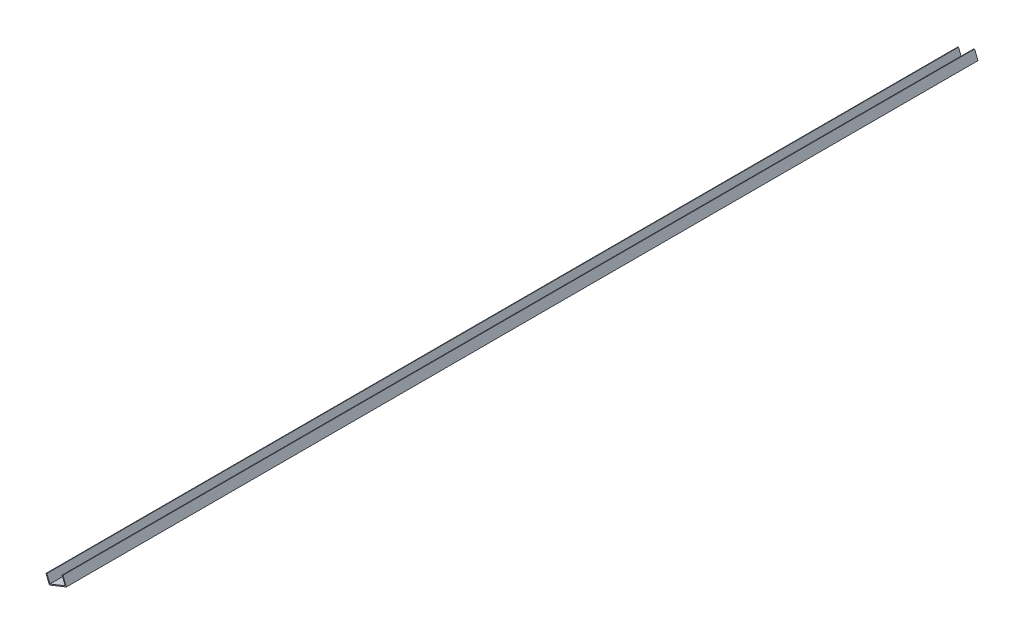
ISO-10303-21;
HEADER;
FILE_DESCRIPTION(('STEP AP214'),'2;1');
FILE_NAME('part.step','',(''),(''),'','','');
FILE_SCHEMA(('AUTOMOTIVE_DESIGN { 1 0 10303 214 1 1 1 1 }'));
ENDSEC;
DATA;
#1=APPLICATION_CONTEXT('core data for automotive mechanical design processes');
#2=APPLICATION_PROTOCOL_DEFINITION('international standard','automotive_design',2000,#1);
#3=PRODUCT_CONTEXT('',#1,'mechanical');
#4=PRODUCT('Part','Part','',(#3));
#5=PRODUCT_RELATED_PRODUCT_CATEGORY('part','',(#4));
#6=PRODUCT_DEFINITION_FORMATION('','',#4);
#7=PRODUCT_DEFINITION_CONTEXT('part definition',#1,'design');
#8=PRODUCT_DEFINITION('design','',#6,#7);
#9=PRODUCT_DEFINITION_SHAPE('','',#8);
#10=(LENGTH_UNIT() NAMED_UNIT(*) SI_UNIT(.MILLI.,.METRE.));
#11=(NAMED_UNIT(*) PLANE_ANGLE_UNIT() SI_UNIT($,.RADIAN.));
#12=(NAMED_UNIT(*) SI_UNIT($,.STERADIAN.) SOLID_ANGLE_UNIT());
#13=UNCERTAINTY_MEASURE_WITH_UNIT(LENGTH_MEASURE(1.E-05),#10,'distance_accuracy_value','');
#14=(GEOMETRIC_REPRESENTATION_CONTEXT(3) GLOBAL_UNCERTAINTY_ASSIGNED_CONTEXT((#13)) GLOBAL_UNIT_ASSIGNED_CONTEXT((#10,
#11,#12)) REPRESENTATION_CONTEXT('',''));
#15=CARTESIAN_POINT('',(0.,0.,0.));
#16=DIRECTION('',(0.,0.,1.));
#17=DIRECTION('',(1.,0.,0.));
#18=AXIS2_PLACEMENT_3D('',#15,#16,#17);
#19=CARTESIAN_POINT('',(9496.46192244909,3814.27996112395,5000.));
#20=DIRECTION('',(-0.927946902696305,-0.372712416987057,0.));
#21=DIRECTION('',(0.372712416987057,-0.927946902696305,0.));
#22=AXIS2_PLACEMENT_3D('',#19,#20,#21);
#23=PLANE('',#22);
#24=DIRECTION('',(-0.372712416987057,0.927946902696305,0.));
#25=VECTOR('',#24,1.);
#26=CARTESIAN_POINT('',(9496.46192244909,3814.27996112395,0.));
#27=LINE('',#26,#25);
#28=CARTESIAN_POINT('',(6775.52101734413,10588.6415606719,0.));
#29=VERTEX_POINT('',#28);
#30=CARTESIAN_POINT('',(6756.88539649478,10635.0389058067,0.));
#31=VERTEX_POINT('',#30);
#32=EDGE_CURVE('E135',#29,#31,#27,.T.);
#33=ORIENTED_EDGE('',*,*,#32,.F.);
#34=DIRECTION('',(0.,0.,-1.));
#35=VECTOR('',#34,1.);
#36=CARTESIAN_POINT('',(6775.52101734413,10588.6415606719,5000.));
#37=LINE('',#36,#35);
#38=CARTESIAN_POINT('',(6775.52101734413,10588.6415606719,5000.));
#39=VERTEX_POINT('',#38);
#40=EDGE_CURVE('E11',#39,#29,#37,.T.);
#41=ORIENTED_EDGE('',*,*,#40,.F.);
#42=DIRECTION('',(-0.372712416987057,0.927946902696305,0.));
#43=VECTOR('',#42,1.);
#44=CARTESIAN_POINT('',(9496.46192244909,3814.27996112395,5000.));
#45=LINE('',#44,#43);
#46=CARTESIAN_POINT('',(6756.88539649478,10635.0389058067,5000.));
#47=VERTEX_POINT('',#46);
#48=EDGE_CURVE('E155',#39,#47,#45,.T.);
#49=ORIENTED_EDGE('',*,*,#48,.T.);
#50=DIRECTION('',(0.,0.,-1.));
#51=VECTOR('',#50,1.);
#52=CARTESIAN_POINT('',(6756.88539649478,10635.0389058067,5000.));
#53=LINE('',#52,#51);
#54=EDGE_CURVE('E57',#47,#31,#53,.T.);
#55=ORIENTED_EDGE('',*,*,#54,.T.);
#56=EDGE_LOOP('',(#33,#41,#49,#55));
#57=FACE_BOUND('',#56,.T.);
#58=ADVANCED_FACE('F41',(#57),#23,.T.);
#59=CARTESIAN_POINT('',(-2720.9409051051,6774.36159954736,5000.));
#60=DIRECTION('',(-0.372712416987103,0.927946902696287,0.));
#61=DIRECTION('',(-0.927946902696287,-0.372712416987103,0.));
#62=AXIS2_PLACEMENT_3D('',#59,#60,#61);
#63=PLANE('',#62);
#64=DIRECTION('',(0.927946902696287,0.372712416987103,0.));
#65=VECTOR('',#64,1.);
#66=CARTESIAN_POINT('',(-2720.9409051051,6774.36159954736,0.));
#67=LINE('',#66,#65);
#68=CARTESIAN_POINT('',(6868.31570761376,10625.9128023706,0.));
#69=VERTEX_POINT('',#68);
#70=EDGE_CURVE('E137',#29,#69,#67,.T.);
#71=ORIENTED_EDGE('',*,*,#70,.T.);
#72=DIRECTION('',(0.,0.,-1.));
#73=VECTOR('',#72,1.);
#74=CARTESIAN_POINT('',(6868.31570761376,10625.9128023706,5000.));
#75=LINE('',#74,#73);
#76=CARTESIAN_POINT('',(6868.31570761376,10625.9128023706,5000.));
#77=VERTEX_POINT('',#76);
#78=EDGE_CURVE('E49',#77,#69,#75,.T.);
#79=ORIENTED_EDGE('',*,*,#78,.F.);
#80=DIRECTION('',(0.927946902696287,0.372712416987103,0.));
#81=VECTOR('',#80,1.);
#82=CARTESIAN_POINT('',(-2720.9409051051,6774.36159954736,5000.));
#83=LINE('',#82,#81);
#84=EDGE_CURVE('E180',#39,#77,#83,.T.);
#85=ORIENTED_EDGE('',*,*,#84,.F.);
#86=ORIENTED_EDGE('',*,*,#40,.T.);
#87=EDGE_LOOP('',(#71,#79,#85,#86));
#88=FACE_BOUND('',#87,.T.);
#89=ADVANCED_FACE('F171',(#88),#63,.F.);
#90=CARTESIAN_POINT('',(9589.25661271878,3851.5512028229,5000.));
#91=DIRECTION('',(0.927946902696298,0.372712416987075,0.));
#92=DIRECTION('',(-0.372712416987075,0.927946902696298,0.));
#93=AXIS2_PLACEMENT_3D('',#90,#91,#92);
#94=PLANE('',#93);
#95=DIRECTION('',(0.372712416987075,-0.927946902696298,0.));
#96=VECTOR('',#95,1.);
#97=CARTESIAN_POINT('',(9589.25661271878,3851.5512028229,0.));
#98=LINE('',#97,#96);
#99=CARTESIAN_POINT('',(6849.68008676441,10672.3101475054,0.));
#100=VERTEX_POINT('',#99);
#101=EDGE_CURVE('E140',#100,#69,#98,.T.);
#102=ORIENTED_EDGE('',*,*,#101,.F.);
#103=DIRECTION('',(0.,0.,-1.));
#104=VECTOR('',#103,1.);
#105=CARTESIAN_POINT('',(6849.68008676441,10672.3101475054,5000.));
#106=LINE('',#105,#104);
#107=CARTESIAN_POINT('',(6849.68008676441,10672.3101475054,5000.));
#108=VERTEX_POINT('',#107);
#109=EDGE_CURVE('E161',#108,#100,#106,.T.);
#110=ORIENTED_EDGE('',*,*,#109,.F.);
#111=DIRECTION('',(0.372712416987075,-0.927946902696298,0.));
#112=VECTOR('',#111,1.);
#113=CARTESIAN_POINT('',(9589.25661271878,3851.5512028229,5000.));
#114=LINE('',#113,#112);
#115=EDGE_CURVE('E168',#108,#77,#114,.T.);
#116=ORIENTED_EDGE('',*,*,#115,.T.);
#117=ORIENTED_EDGE('',*,*,#78,.T.);
#118=EDGE_LOOP('',(#102,#110,#116,#117));
#119=FACE_BOUND('',#118,.T.);
#120=ADVANCED_FACE('F166',(#119),#94,.T.);
#121=CARTESIAN_POINT('',(-2739.5765259565,6820.75894467372,5000.));
#122=DIRECTION('',(-0.372712416987739,0.927946902696031,0.));
#123=DIRECTION('',(-0.927946902696031,-0.372712416987739,0.));
#124=AXIS2_PLACEMENT_3D('',#121,#122,#123);
#125=PLANE('',#124);
#126=DIRECTION('',(0.927946902696031,0.372712416987739,0.));
#127=VECTOR('',#126,1.);
#128=CARTESIAN_POINT('',(-2739.5765259565,6820.75894467372,0.));
#129=LINE('',#128,#127);
#130=CARTESIAN_POINT('',(6845.04035225093,10670.4465854205,0.));
#131=VERTEX_POINT('',#130);
#132=EDGE_CURVE('E143',#131,#100,#129,.T.);
#133=ORIENTED_EDGE('',*,*,#132,.F.);
#134=DIRECTION('',(0.,0.,-1.));
#135=VECTOR('',#134,1.);
#136=CARTESIAN_POINT('',(6845.04035225093,10670.4465854205,5000.));
#137=LINE('',#136,#135);
#138=CARTESIAN_POINT('',(6845.04035225093,10670.4465854205,5000.));
#139=VERTEX_POINT('',#138);
#140=EDGE_CURVE('E159',#139,#131,#137,.T.);
#141=ORIENTED_EDGE('',*,*,#140,.F.);
#142=DIRECTION('',(0.927946902696031,0.372712416987739,0.));
#143=VECTOR('',#142,1.);
#144=CARTESIAN_POINT('',(-2739.5765259565,6820.75894467372,5000.));
#145=LINE('',#144,#143);
#146=EDGE_CURVE('E179',#139,#108,#145,.T.);
#147=ORIENTED_EDGE('',*,*,#146,.T.);
#148=ORIENTED_EDGE('',*,*,#109,.T.);
#149=EDGE_LOOP('',(#133,#141,#147,#148));
#150=FACE_BOUND('',#149,.T.);
#151=ADVANCED_FACE('F177',(#150),#125,.T.);
#152=CARTESIAN_POINT('',(9584.61687820524,3849.68764073775,5000.));
#153=DIRECTION('',(0.927946902696304,0.372712416987059,0.));
#154=DIRECTION('',(-0.372712416987059,0.927946902696304,0.));
#155=AXIS2_PLACEMENT_3D('',#152,#153,#154);
#156=PLANE('',#155);
#157=DIRECTION('',(0.372712416987059,-0.927946902696304,0.));
#158=VECTOR('',#157,1.);
#159=CARTESIAN_POINT('',(9584.61687820524,3849.68764073775,0.));
#160=LINE('',#159,#158);
#161=CARTESIAN_POINT('',(6861.81241101535,10628.6889747992,0.));
#162=VERTEX_POINT('',#161);
#163=EDGE_CURVE('E146',#131,#162,#160,.T.);
#164=ORIENTED_EDGE('',*,*,#163,.T.);
#165=DIRECTION('',(0.,0.,-1.));
#166=VECTOR('',#165,1.);
#167=CARTESIAN_POINT('',(6861.81241101535,10628.6889747992,5000.));
#168=LINE('',#167,#166);
#169=CARTESIAN_POINT('',(6861.81241101535,10628.6889747992,5000.));
#170=VERTEX_POINT('',#169);
#171=EDGE_CURVE('E116',#170,#162,#168,.T.);
#172=ORIENTED_EDGE('',*,*,#171,.F.);
#173=DIRECTION('',(0.372712416987059,-0.927946902696304,0.));
#174=VECTOR('',#173,1.);
#175=CARTESIAN_POINT('',(9584.61687820524,3849.68764073775,5000.));
#176=LINE('',#175,#174);
#177=EDGE_CURVE('E126',#139,#170,#176,.T.);
#178=ORIENTED_EDGE('',*,*,#177,.F.);
#179=ORIENTED_EDGE('',*,*,#140,.T.);
#180=EDGE_LOOP('',(#164,#172,#178,#179));
#181=FACE_BOUND('',#180,.T.);
#182=ADVANCED_FACE('F206',(#181),#156,.F.);
#183=CARTESIAN_POINT('',(-2722.80446719007,6779.00133406069,5000.));
#184=DIRECTION('',(-0.372712416987114,0.927946902696282,0.));
#185=DIRECTION('',(-0.927946902696282,-0.372712416987114,0.));
#186=AXIS2_PLACEMENT_3D('',#183,#184,#185);
#187=PLANE('',#186);
#188=DIRECTION('',(0.927946902696282,0.372712416987114,0.));
#189=VECTOR('',#188,1.);
#190=CARTESIAN_POINT('',(-2722.80446719007,6779.00133406069,0.));
#191=LINE('',#190,#189);
#192=CARTESIAN_POINT('',(6778.29718977268,10595.1448572703,0.));
#193=VERTEX_POINT('',#192);
#194=EDGE_CURVE('E112',#193,#162,#191,.T.);
#195=ORIENTED_EDGE('',*,*,#194,.F.);
#196=DIRECTION('',(0.,0.,-1.));
#197=VECTOR('',#196,1.);
#198=CARTESIAN_POINT('',(6778.29718977268,10595.1448572703,5000.));
#199=LINE('',#198,#197);
#200=CARTESIAN_POINT('',(6778.29718977268,10595.1448572703,5000.));
#201=VERTEX_POINT('',#200);
#202=EDGE_CURVE('E107',#201,#193,#199,.T.);
#203=ORIENTED_EDGE('',*,*,#202,.F.);
#204=DIRECTION('',(0.927946902696282,0.372712416987114,0.));
#205=VECTOR('',#204,1.);
#206=CARTESIAN_POINT('',(-2722.80446719007,6779.00133406069,5000.));
#207=LINE('',#206,#205);
#208=EDGE_CURVE('E110',#201,#170,#207,.T.);
#209=ORIENTED_EDGE('',*,*,#208,.T.);
#210=ORIENTED_EDGE('',*,*,#171,.T.);
#211=EDGE_LOOP('',(#195,#203,#209,#210));
#212=FACE_BOUND('',#211,.T.);
#213=ADVANCED_FACE('F109',(#212),#187,.T.);
#214=CARTESIAN_POINT('',(9501.10165696259,3816.14352320896,5000.));
#215=DIRECTION('',(0.927946902696303,0.372712416987062,0.));
#216=DIRECTION('',(-0.372712416987062,0.927946902696303,0.));
#217=AXIS2_PLACEMENT_3D('',#214,#215,#216);
#218=PLANE('',#217);
#219=DIRECTION('',(0.372712416987062,-0.927946902696303,0.));
#220=VECTOR('',#219,1.);
#221=CARTESIAN_POINT('',(9501.10165696259,3816.14352320896,0.));
#222=LINE('',#221,#220);
#223=CARTESIAN_POINT('',(6761.52513100826,10636.9024678917,0.));
#224=VERTEX_POINT('',#223);
#225=EDGE_CURVE('E150',#224,#193,#222,.T.);
#226=ORIENTED_EDGE('',*,*,#225,.F.);
#227=DIRECTION('',(0.,0.,-1.));
#228=VECTOR('',#227,1.);
#229=CARTESIAN_POINT('',(6761.52513100826,10636.9024678917,5000.));
#230=LINE('',#229,#228);
#231=CARTESIAN_POINT('',(6761.52513100826,10636.9024678917,5000.));
#232=VERTEX_POINT('',#231);
#233=EDGE_CURVE('E82',#232,#224,#230,.T.);
#234=ORIENTED_EDGE('',*,*,#233,.F.);
#235=DIRECTION('',(0.372712416987062,-0.927946902696303,0.));
#236=VECTOR('',#235,1.);
#237=CARTESIAN_POINT('',(9501.10165696259,3816.14352320896,5000.));
#238=LINE('',#237,#236);
#239=EDGE_CURVE('E123',#232,#201,#238,.T.);
#240=ORIENTED_EDGE('',*,*,#239,.T.);
#241=ORIENTED_EDGE('',*,*,#202,.T.);
#242=EDGE_LOOP('',(#226,#234,#240,#241));
#243=FACE_BOUND('',#242,.T.);
#244=ADVANCED_FACE('F129',(#243),#218,.T.);
#245=CARTESIAN_POINT('',(-2739.57652595434,6820.75894468266,5000.));
#246=DIRECTION('',(-0.372712416987066,0.927946902696302,0.));
#247=DIRECTION('',(-0.927946902696302,-0.372712416987066,0.));
#248=AXIS2_PLACEMENT_3D('',#245,#246,#247);
#249=PLANE('',#248);
#250=DIRECTION('',(0.927946902696302,0.372712416987066,0.));
#251=VECTOR('',#250,1.);
#252=CARTESIAN_POINT('',(-2739.57652595434,6820.75894468266,0.));
#253=LINE('',#252,#251);
#254=EDGE_CURVE('E152',#31,#224,#253,.T.);
#255=ORIENTED_EDGE('',*,*,#254,.F.);
#256=ORIENTED_EDGE('',*,*,#54,.F.);
#257=DIRECTION('',(0.927946902696302,0.372712416987066,0.));
#258=VECTOR('',#257,1.);
#259=CARTESIAN_POINT('',(-2739.57652595434,6820.75894468266,5000.));
#260=LINE('',#259,#258);
#261=EDGE_CURVE('E130',#47,#232,#260,.T.);
#262=ORIENTED_EDGE('',*,*,#261,.T.);
#263=ORIENTED_EDGE('',*,*,#233,.T.);
#264=EDGE_LOOP('',(#255,#256,#262,#263));
#265=FACE_BOUND('',#264,.T.);
#266=ADVANCED_FACE('F185',(#265),#249,.T.);
#267=CARTESIAN_POINT('',(0.,0.,5000.));
#268=DIRECTION('',(0.,0.,1.));
#269=DIRECTION('',(1.,0.,0.));
#270=AXIS2_PLACEMENT_3D('',#267,#268,#269);
#271=PLANE('',#270);
#272=ORIENTED_EDGE('',*,*,#48,.F.);
#273=ORIENTED_EDGE('',*,*,#84,.T.);
#274=ORIENTED_EDGE('',*,*,#115,.F.);
#275=ORIENTED_EDGE('',*,*,#146,.F.);
#276=ORIENTED_EDGE('',*,*,#177,.T.);
#277=ORIENTED_EDGE('',*,*,#208,.F.);
#278=ORIENTED_EDGE('',*,*,#239,.F.);
#279=ORIENTED_EDGE('',*,*,#261,.F.);
#280=EDGE_LOOP('',(#272,#273,#274,#275,#276,#277,#278,#279));
#281=FACE_BOUND('',#280,.T.);
#282=ADVANCED_FACE('F121',(#281),#271,.T.);
#283=CARTESIAN_POINT('',(0.,0.,0.));
#284=DIRECTION('',(0.,0.,1.));
#285=DIRECTION('',(1.,0.,0.));
#286=AXIS2_PLACEMENT_3D('',#283,#284,#285);
#287=PLANE('',#286);
#288=ORIENTED_EDGE('',*,*,#32,.T.);
#289=ORIENTED_EDGE('',*,*,#254,.T.);
#290=ORIENTED_EDGE('',*,*,#225,.T.);
#291=ORIENTED_EDGE('',*,*,#194,.T.);
#292=ORIENTED_EDGE('',*,*,#163,.F.);
#293=ORIENTED_EDGE('',*,*,#132,.T.);
#294=ORIENTED_EDGE('',*,*,#101,.T.);
#295=ORIENTED_EDGE('',*,*,#70,.F.);
#296=EDGE_LOOP('',(#288,#289,#290,#291,#292,#293,#294,#295));
#297=FACE_BOUND('',#296,.T.);
#298=ADVANCED_FACE('F173',(#297),#287,.F.);
#299=CLOSED_SHELL('',(#58,#89,#120,#151,#182,#213,#244,#266,#282,#298));
#300=MANIFOLD_SOLID_BREP('B2',#299);
#301=ADVANCED_BREP_SHAPE_REPRESENTATION('',(#18,#300),#14);
#302=SHAPE_DEFINITION_REPRESENTATION(#9,#301);
ENDSEC;
END-ISO-10303-21;
